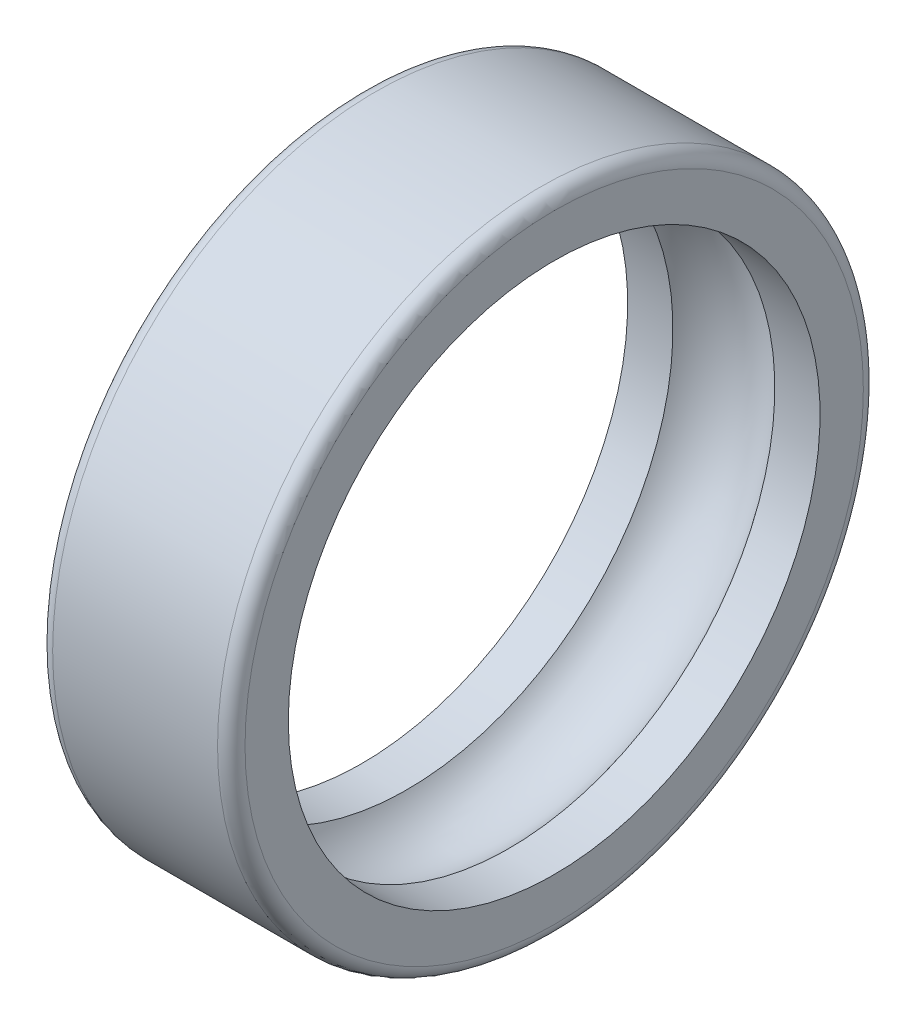
ISO-10303-21;
HEADER;
FILE_DESCRIPTION(('STEP AP214'),'2;1');
FILE_NAME('part.step','',(''),(''),'','','');
FILE_SCHEMA(('AUTOMOTIVE_DESIGN { 1 0 10303 214 1 1 1 1 }'));
ENDSEC;
DATA;
#1=APPLICATION_CONTEXT('core data for automotive mechanical design processes');
#2=APPLICATION_PROTOCOL_DEFINITION('international standard','automotive_design',2000,#1);
#3=PRODUCT_CONTEXT('',#1,'mechanical');
#4=PRODUCT('Part','Part','',(#3));
#5=PRODUCT_RELATED_PRODUCT_CATEGORY('part','',(#4));
#6=PRODUCT_DEFINITION_FORMATION('','',#4);
#7=PRODUCT_DEFINITION_CONTEXT('part definition',#1,'design');
#8=PRODUCT_DEFINITION('design','',#6,#7);
#9=PRODUCT_DEFINITION_SHAPE('','',#8);
#10=(LENGTH_UNIT() NAMED_UNIT(*) SI_UNIT(.MILLI.,.METRE.));
#11=(NAMED_UNIT(*) PLANE_ANGLE_UNIT() SI_UNIT($,.RADIAN.));
#12=(NAMED_UNIT(*) SI_UNIT($,.STERADIAN.) SOLID_ANGLE_UNIT());
#13=UNCERTAINTY_MEASURE_WITH_UNIT(LENGTH_MEASURE(1.E-05),#10,'distance_accuracy_value','');
#14=(GEOMETRIC_REPRESENTATION_CONTEXT(3) GLOBAL_UNCERTAINTY_ASSIGNED_CONTEXT((#13)) GLOBAL_UNIT_ASSIGNED_CONTEXT((#10,
#11,#12)) REPRESENTATION_CONTEXT('',''));
#15=CARTESIAN_POINT('',(0.,0.,0.));
#16=DIRECTION('',(0.,0.,1.));
#17=DIRECTION('',(1.,0.,0.));
#18=AXIS2_PLACEMENT_3D('',#15,#16,#17);
#19=CARTESIAN_POINT('',(0.,22.5,0.));
#20=DIRECTION('',(1.,0.,0.));
#21=DIRECTION('',(0.,0.,-1.));
#22=AXIS2_PLACEMENT_3D('',#19,#20,#21);
#23=PLANE('',#22);
#24=CARTESIAN_POINT('',(0.,0.,0.));
#25=DIRECTION('',(-1.,0.,0.));
#26=DIRECTION('',(0.,0.,1.));
#27=AXIS2_PLACEMENT_3D('',#24,#25,#26);
#28=CIRCLE('',#27,19.35);
#29=CARTESIAN_POINT('',(0.,0.,19.35));
#30=VERTEX_POINT('',#29);
#31=EDGE_CURVE('E10',#30,#30,#28,.T.);
#32=ORIENTED_EDGE('',*,*,#31,.F.);
#33=EDGE_LOOP('',(#32));
#34=FACE_BOUND('',#33,.T.);
#35=CARTESIAN_POINT('',(0.,0.,0.));
#36=DIRECTION('',(-1.,0.,0.));
#37=DIRECTION('',(0.,0.,1.));
#38=AXIS2_PLACEMENT_3D('',#35,#36,#37);
#39=CIRCLE('',#38,22.5);
#40=CARTESIAN_POINT('',(0.,0.,22.5));
#41=VERTEX_POINT('',#40);
#42=EDGE_CURVE('E43',#41,#41,#39,.T.);
#43=ORIENTED_EDGE('',*,*,#42,.T.);
#44=EDGE_LOOP('',(#43));
#45=FACE_BOUND('',#44,.T.);
#46=ADVANCED_FACE('F15',(#34,#45),#23,.F.);
#47=CARTESIAN_POINT('',(0.,0.,0.));
#48=DIRECTION('',(-1.,0.,0.));
#49=DIRECTION('',(0.,0.,1.));
#50=AXIS2_PLACEMENT_3D('',#47,#48,#49);
#51=CYLINDRICAL_SURFACE('',#50,19.35);
#52=CARTESIAN_POINT('',(3.29223787170752,0.,0.));
#53=DIRECTION('',(-1.,0.,0.));
#54=DIRECTION('',(0.,0.,1.));
#55=AXIS2_PLACEMENT_3D('',#52,#53,#54);
#56=CIRCLE('',#55,19.35);
#57=CARTESIAN_POINT('',(3.29223787170752,0.,19.35));
#58=VERTEX_POINT('',#57);
#59=EDGE_CURVE('E21',#58,#58,#56,.T.);
#60=ORIENTED_EDGE('',*,*,#59,.F.);
#61=EDGE_LOOP('',(#60));
#62=FACE_BOUND('',#61,.T.);
#63=ORIENTED_EDGE('',*,*,#31,.T.);
#64=EDGE_LOOP('',(#63));
#65=FACE_BOUND('',#64,.T.);
#66=ADVANCED_FACE('F80',(#62,#65),#51,.F.);
#67=CARTESIAN_POINT('',(7.,0.,0.));
#68=DIRECTION('',(-1.,0.,0.));
#69=DIRECTION('',(0.,0.,1.));
#70=AXIS2_PLACEMENT_3D('',#67,#68,#69);
#71=TOROIDAL_SURFACE('',#70,16.8,4.5);
#72=ORIENTED_EDGE('',*,*,#59,.T.);
#73=EDGE_LOOP('',(#72));
#74=FACE_BOUND('',#73,.T.);
#75=CARTESIAN_POINT('',(10.7077621282925,0.,0.));
#76=DIRECTION('',(-1.,0.,0.));
#77=DIRECTION('',(0.,0.,1.));
#78=AXIS2_PLACEMENT_3D('',#75,#76,#77);
#79=CIRCLE('',#78,19.35);
#80=CARTESIAN_POINT('',(10.7077621282925,0.,19.35));
#81=VERTEX_POINT('',#80);
#82=EDGE_CURVE('E25',#81,#81,#79,.T.);
#83=ORIENTED_EDGE('',*,*,#82,.F.);
#84=EDGE_LOOP('',(#83));
#85=FACE_BOUND('',#84,.T.);
#86=ADVANCED_FACE('F75',(#74,#85),#71,.F.);
#87=CARTESIAN_POINT('',(0.,0.,0.));
#88=DIRECTION('',(-1.,0.,0.));
#89=DIRECTION('',(0.,0.,1.));
#90=AXIS2_PLACEMENT_3D('',#87,#88,#89);
#91=CYLINDRICAL_SURFACE('',#90,19.35);
#92=CARTESIAN_POINT('',(14.,0.,0.));
#93=DIRECTION('',(-1.,0.,0.));
#94=DIRECTION('',(0.,0.,1.));
#95=AXIS2_PLACEMENT_3D('',#92,#93,#94);
#96=CIRCLE('',#95,19.35);
#97=CARTESIAN_POINT('',(14.,0.,19.35));
#98=VERTEX_POINT('',#97);
#99=EDGE_CURVE('E29',#98,#98,#96,.T.);
#100=ORIENTED_EDGE('',*,*,#99,.F.);
#101=EDGE_LOOP('',(#100));
#102=FACE_BOUND('',#101,.T.);
#103=ORIENTED_EDGE('',*,*,#82,.T.);
#104=EDGE_LOOP('',(#103));
#105=FACE_BOUND('',#104,.T.);
#106=ADVANCED_FACE('F69',(#102,#105),#91,.F.);
#107=CARTESIAN_POINT('',(14.,19.35,0.));
#108=DIRECTION('',(-1.,0.,0.));
#109=DIRECTION('',(0.,0.,1.));
#110=AXIS2_PLACEMENT_3D('',#107,#108,#109);
#111=PLANE('',#110);
#112=CARTESIAN_POINT('',(14.,0.,0.));
#113=DIRECTION('',(-1.,0.,0.));
#114=DIRECTION('',(0.,0.,1.));
#115=AXIS2_PLACEMENT_3D('',#112,#113,#114);
#116=CIRCLE('',#115,22.5);
#117=CARTESIAN_POINT('',(14.,0.,22.5));
#118=VERTEX_POINT('',#117);
#119=EDGE_CURVE('E34',#118,#118,#116,.T.);
#120=ORIENTED_EDGE('',*,*,#119,.F.);
#121=EDGE_LOOP('',(#120));
#122=FACE_BOUND('',#121,.T.);
#123=ORIENTED_EDGE('',*,*,#99,.T.);
#124=EDGE_LOOP('',(#123));
#125=FACE_BOUND('',#124,.T.);
#126=ADVANCED_FACE('F63',(#122,#125),#111,.F.);
#127=CARTESIAN_POINT('',(13.,0.,0.));
#128=DIRECTION('',(-1.,0.,0.));
#129=DIRECTION('',(0.,0.,1.));
#130=AXIS2_PLACEMENT_3D('',#127,#128,#129);
#131=TOROIDAL_SURFACE('',#130,22.5,1.);
#132=CARTESIAN_POINT('',(13.,0.,0.));
#133=DIRECTION('',(-1.,0.,0.));
#134=DIRECTION('',(0.,0.,1.));
#135=AXIS2_PLACEMENT_3D('',#132,#133,#134);
#136=CIRCLE('',#135,23.5);
#137=CARTESIAN_POINT('',(13.,0.,23.5));
#138=VERTEX_POINT('',#137);
#139=EDGE_CURVE('E37',#138,#138,#136,.T.);
#140=ORIENTED_EDGE('',*,*,#139,.F.);
#141=EDGE_LOOP('',(#140));
#142=FACE_BOUND('',#141,.T.);
#143=ORIENTED_EDGE('',*,*,#119,.T.);
#144=EDGE_LOOP('',(#143));
#145=FACE_BOUND('',#144,.T.);
#146=ADVANCED_FACE('F57',(#142,#145),#131,.T.);
#147=CARTESIAN_POINT('',(0.,0.,0.));
#148=DIRECTION('',(-1.,0.,0.));
#149=DIRECTION('',(0.,0.,1.));
#150=AXIS2_PLACEMENT_3D('',#147,#148,#149);
#151=CYLINDRICAL_SURFACE('',#150,23.5);
#152=CARTESIAN_POINT('',(1.,0.,0.));
#153=DIRECTION('',(-1.,0.,0.));
#154=DIRECTION('',(0.,0.,1.));
#155=AXIS2_PLACEMENT_3D('',#152,#153,#154);
#156=CIRCLE('',#155,23.5);
#157=CARTESIAN_POINT('',(1.,0.,23.5));
#158=VERTEX_POINT('',#157);
#159=EDGE_CURVE('E40',#158,#158,#156,.T.);
#160=ORIENTED_EDGE('',*,*,#159,.F.);
#161=EDGE_LOOP('',(#160));
#162=FACE_BOUND('',#161,.T.);
#163=ORIENTED_EDGE('',*,*,#139,.T.);
#164=EDGE_LOOP('',(#163));
#165=FACE_BOUND('',#164,.T.);
#166=ADVANCED_FACE('F51',(#162,#165),#151,.T.);
#167=CARTESIAN_POINT('',(1.,0.,0.));
#168=DIRECTION('',(-1.,0.,0.));
#169=DIRECTION('',(0.,0.,1.));
#170=AXIS2_PLACEMENT_3D('',#167,#168,#169);
#171=TOROIDAL_SURFACE('',#170,22.5,1.);
#172=ORIENTED_EDGE('',*,*,#42,.F.);
#173=EDGE_LOOP('',(#172));
#174=FACE_BOUND('',#173,.T.);
#175=ORIENTED_EDGE('',*,*,#159,.T.);
#176=EDGE_LOOP('',(#175));
#177=FACE_BOUND('',#176,.T.);
#178=ADVANCED_FACE('F48',(#174,#177),#171,.T.);
#179=CLOSED_SHELL('',(#46,#66,#86,#106,#126,#146,#166,#178));
#180=MANIFOLD_SOLID_BREP('B1',#179);
#181=ADVANCED_BREP_SHAPE_REPRESENTATION('',(#18,#180),#14);
#182=SHAPE_DEFINITION_REPRESENTATION(#9,#181);
ENDSEC;
END-ISO-10303-21;
